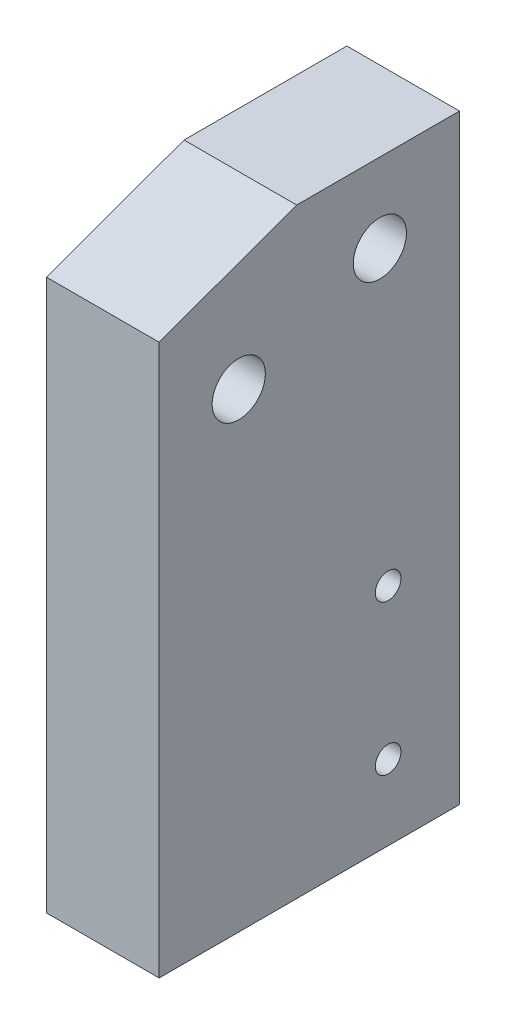
ISO-10303-21;
HEADER;
FILE_DESCRIPTION(('STEP AP214'),'2;1');
FILE_NAME('part.step','',(''),(''),'','','');
FILE_SCHEMA(('AUTOMOTIVE_DESIGN { 1 0 10303 214 1 1 1 1 }'));
ENDSEC;
DATA;
#1=APPLICATION_CONTEXT('core data for automotive mechanical design processes');
#2=APPLICATION_PROTOCOL_DEFINITION('international standard','automotive_design',2000,#1);
#3=PRODUCT_CONTEXT('',#1,'mechanical');
#4=PRODUCT('Part','Part','',(#3));
#5=PRODUCT_RELATED_PRODUCT_CATEGORY('part','',(#4));
#6=PRODUCT_DEFINITION_FORMATION('','',#4);
#7=PRODUCT_DEFINITION_CONTEXT('part definition',#1,'design');
#8=PRODUCT_DEFINITION('design','',#6,#7);
#9=PRODUCT_DEFINITION_SHAPE('','',#8);
#10=(LENGTH_UNIT() NAMED_UNIT(*) SI_UNIT(.MILLI.,.METRE.));
#11=(NAMED_UNIT(*) PLANE_ANGLE_UNIT() SI_UNIT($,.RADIAN.));
#12=(NAMED_UNIT(*) SI_UNIT($,.STERADIAN.) SOLID_ANGLE_UNIT());
#13=UNCERTAINTY_MEASURE_WITH_UNIT(LENGTH_MEASURE(1.E-05),#10,'distance_accuracy_value','');
#14=(GEOMETRIC_REPRESENTATION_CONTEXT(3) GLOBAL_UNCERTAINTY_ASSIGNED_CONTEXT((#13)) GLOBAL_UNIT_ASSIGNED_CONTEXT((#10,
#11,#12)) REPRESENTATION_CONTEXT('',''));
#15=CARTESIAN_POINT('',(0.,0.,0.));
#16=DIRECTION('',(0.,0.,1.));
#17=DIRECTION('',(1.,0.,0.));
#18=AXIS2_PLACEMENT_3D('',#15,#16,#17);
#19=CARTESIAN_POINT('',(28.575,152.4,0.));
#20=DIRECTION('',(-1.,0.,0.));
#21=DIRECTION('',(0.,0.,1.));
#22=AXIS2_PLACEMENT_3D('',#19,#20,#21);
#23=PLANE('',#22);
#24=CARTESIAN_POINT('',(28.575,57.15,-58.1000000000001));
#25=DIRECTION('',(1.,0.,0.));
#26=DIRECTION('',(0.,0.,-1.));
#27=AXIS2_PLACEMENT_3D('',#24,#25,#26);
#28=CIRCLE('',#27,3.26389999999999);
#29=CARTESIAN_POINT('',(28.575,57.15,-61.3639000000001));
#30=VERTEX_POINT('',#29);
#31=EDGE_CURVE('E220',#30,#30,#28,.T.);
#32=ORIENTED_EDGE('',*,*,#31,.F.);
#33=EDGE_LOOP('',(#32));
#34=FACE_BOUND('',#33,.T.);
#35=CARTESIAN_POINT('',(28.575,19.05,-58.1000000000001));
#36=DIRECTION('',(1.,0.,0.));
#37=DIRECTION('',(0.,0.,-1.));
#38=AXIS2_PLACEMENT_3D('',#35,#36,#37);
#39=CIRCLE('',#38,3.26389999999999);
#40=CARTESIAN_POINT('',(28.575,19.05,-61.3639000000001));
#41=VERTEX_POINT('',#40);
#42=EDGE_CURVE('E166',#41,#41,#39,.T.);
#43=ORIENTED_EDGE('',*,*,#42,.F.);
#44=EDGE_LOOP('',(#43));
#45=FACE_BOUND('',#44,.T.);
#46=CARTESIAN_POINT('',(28.575,132.348217804812,-56.0011444259716));
#47=DIRECTION('',(1.,0.,0.));
#48=DIRECTION('',(0.,0.,-1.));
#49=AXIS2_PLACEMENT_3D('',#46,#47,#48);
#50=CIRCLE('',#49,6.74623999999999);
#51=CARTESIAN_POINT('',(28.575,132.348217804812,-62.7473844259716));
#52=VERTEX_POINT('',#51);
#53=EDGE_CURVE('E165',#52,#52,#50,.T.);
#54=ORIENTED_EDGE('',*,*,#53,.F.);
#55=EDGE_LOOP('',(#54));
#56=FACE_BOUND('',#55,.T.);
#57=DIRECTION('',(0.,0.,-1.));
#58=VECTOR('',#57,1.);
#59=CARTESIAN_POINT('',(28.575,152.4,0.));
#60=LINE('',#59,#58);
#61=CARTESIAN_POINT('',(28.575,152.4,-34.8929632270751));
#62=VERTEX_POINT('',#61);
#63=CARTESIAN_POINT('',(28.575,152.4,-76.2));
#64=VERTEX_POINT('',#63);
#65=EDGE_CURVE('E186',#62,#64,#60,.T.);
#66=ORIENTED_EDGE('',*,*,#65,.F.);
#67=DIRECTION('',(0.,-0.342020143325656,0.939692620785913));
#68=VECTOR('',#67,1.);
#69=CARTESIAN_POINT('',(28.575,152.4,-34.8929632270751));
#70=LINE('',#69,#68);
#71=CARTESIAN_POINT('',(28.575,139.7,0.));
#72=VERTEX_POINT('',#71);
#73=EDGE_CURVE('E57',#62,#72,#70,.T.);
#74=ORIENTED_EDGE('',*,*,#73,.T.);
#75=DIRECTION('',(0.,-1.,0.));
#76=VECTOR('',#75,1.);
#77=CARTESIAN_POINT('',(28.575,152.4,0.));
#78=LINE('',#77,#76);
#79=CARTESIAN_POINT('',(28.575,0.,0.));
#80=VERTEX_POINT('',#79);
#81=EDGE_CURVE('E50',#72,#80,#78,.T.);
#82=ORIENTED_EDGE('',*,*,#81,.T.);
#83=DIRECTION('',(0.,0.,-1.));
#84=VECTOR('',#83,1.);
#85=CARTESIAN_POINT('',(28.575,0.,0.));
#86=LINE('',#85,#84);
#87=CARTESIAN_POINT('',(28.575,0.,-76.2));
#88=VERTEX_POINT('',#87);
#89=EDGE_CURVE('E96',#80,#88,#86,.T.);
#90=ORIENTED_EDGE('',*,*,#89,.T.);
#91=DIRECTION('',(0.,-1.,0.));
#92=VECTOR('',#91,1.);
#93=CARTESIAN_POINT('',(28.575,152.4,-76.2));
#94=LINE('',#93,#92);
#95=EDGE_CURVE('E90',#64,#88,#94,.T.);
#96=ORIENTED_EDGE('',*,*,#95,.F.);
#97=EDGE_LOOP('',(#66,#74,#82,#90,#96));
#98=FACE_BOUND('',#97,.T.);
#99=CARTESIAN_POINT('',(28.575,119.317250344104,-20.1988555740284));
#100=DIRECTION('',(1.,0.,0.));
#101=DIRECTION('',(0.,0.,-1.));
#102=AXIS2_PLACEMENT_3D('',#99,#100,#101);
#103=CIRCLE('',#102,6.74623999999999);
#104=CARTESIAN_POINT('',(28.575,119.317250344104,-26.9450955740284));
#105=VERTEX_POINT('',#104);
#106=EDGE_CURVE('E117',#105,#105,#103,.T.);
#107=ORIENTED_EDGE('',*,*,#106,.F.);
#108=EDGE_LOOP('',(#107));
#109=FACE_BOUND('',#108,.T.);
#110=ADVANCED_FACE('F41',(#34,#45,#56,#98,#109),#23,.F.);
#111=CARTESIAN_POINT('',(0.,152.4,0.));
#112=DIRECTION('',(1.,0.,0.));
#113=DIRECTION('',(0.,0.,-1.));
#114=AXIS2_PLACEMENT_3D('',#111,#112,#113);
#115=PLANE('',#114);
#116=CARTESIAN_POINT('',(0.,57.15,-18.1));
#117=DIRECTION('',(-1.,0.,0.));
#118=DIRECTION('',(0.,0.,1.));
#119=AXIS2_PLACEMENT_3D('',#116,#117,#118);
#120=CIRCLE('',#119,3.26389999999999);
#121=CARTESIAN_POINT('',(0.,57.15,-14.8361));
#122=VERTEX_POINT('',#121);
#123=EDGE_CURVE('E201',#122,#122,#120,.T.);
#124=ORIENTED_EDGE('',*,*,#123,.F.);
#125=EDGE_LOOP('',(#124));
#126=FACE_BOUND('',#125,.T.);
#127=CARTESIAN_POINT('',(0.,19.05,-18.1));
#128=DIRECTION('',(-1.,0.,0.));
#129=DIRECTION('',(0.,0.,1.));
#130=AXIS2_PLACEMENT_3D('',#127,#128,#129);
#131=CIRCLE('',#130,3.26389999999999);
#132=CARTESIAN_POINT('',(0.,19.05,-14.8361));
#133=VERTEX_POINT('',#132);
#134=EDGE_CURVE('E212',#133,#133,#131,.T.);
#135=ORIENTED_EDGE('',*,*,#134,.F.);
#136=EDGE_LOOP('',(#135));
#137=FACE_BOUND('',#136,.T.);
#138=CARTESIAN_POINT('',(0.,132.348217804812,-56.0011444259716));
#139=DIRECTION('',(1.,0.,0.));
#140=DIRECTION('',(0.,0.,-1.));
#141=AXIS2_PLACEMENT_3D('',#138,#139,#140);
#142=CIRCLE('',#141,6.74623999999999);
#143=CARTESIAN_POINT('',(0.,132.348217804812,-62.7473844259716));
#144=VERTEX_POINT('',#143);
#145=EDGE_CURVE('E172',#144,#144,#142,.T.);
#146=ORIENTED_EDGE('',*,*,#145,.T.);
#147=EDGE_LOOP('',(#146));
#148=FACE_BOUND('',#147,.T.);
#149=CARTESIAN_POINT('',(0.,119.317250344104,-20.1988555740284));
#150=DIRECTION('',(1.,0.,0.));
#151=DIRECTION('',(0.,0.,-1.));
#152=AXIS2_PLACEMENT_3D('',#149,#150,#151);
#153=CIRCLE('',#152,6.74623999999999);
#154=CARTESIAN_POINT('',(0.,119.317250344104,-26.9450955740284));
#155=VERTEX_POINT('',#154);
#156=EDGE_CURVE('E110',#155,#155,#153,.T.);
#157=ORIENTED_EDGE('',*,*,#156,.T.);
#158=EDGE_LOOP('',(#157));
#159=FACE_BOUND('',#158,.T.);
#160=DIRECTION('',(0.,-1.,0.));
#161=VECTOR('',#160,1.);
#162=CARTESIAN_POINT('',(0.,152.4,0.));
#163=LINE('',#162,#161);
#164=CARTESIAN_POINT('',(0.,139.7,0.));
#165=VERTEX_POINT('',#164);
#166=CARTESIAN_POINT('',(0.,0.,0.));
#167=VERTEX_POINT('',#166);
#168=EDGE_CURVE('E11',#165,#167,#163,.T.);
#169=ORIENTED_EDGE('',*,*,#168,.F.);
#170=DIRECTION('',(0.,-0.342020143325656,0.939692620785913));
#171=VECTOR('',#170,1.);
#172=CARTESIAN_POINT('',(0.,152.4,-34.8929632270751));
#173=LINE('',#172,#171);
#174=CARTESIAN_POINT('',(0.,152.4,-34.8929632270751));
#175=VERTEX_POINT('',#174);
#176=EDGE_CURVE('E139',#175,#165,#173,.T.);
#177=ORIENTED_EDGE('',*,*,#176,.F.);
#178=DIRECTION('',(0.,0.,1.));
#179=VECTOR('',#178,1.);
#180=CARTESIAN_POINT('',(0.,152.4,0.));
#181=LINE('',#180,#179);
#182=CARTESIAN_POINT('',(0.,152.4,-76.2));
#183=VERTEX_POINT('',#182);
#184=EDGE_CURVE('E95',#183,#175,#181,.T.);
#185=ORIENTED_EDGE('',*,*,#184,.F.);
#186=DIRECTION('',(0.,-1.,0.));
#187=VECTOR('',#186,1.);
#188=CARTESIAN_POINT('',(0.,152.4,-76.2));
#189=LINE('',#188,#187);
#190=CARTESIAN_POINT('',(0.,0.,-76.2));
#191=VERTEX_POINT('',#190);
#192=EDGE_CURVE('E87',#183,#191,#189,.T.);
#193=ORIENTED_EDGE('',*,*,#192,.T.);
#194=DIRECTION('',(0.,0.,1.));
#195=VECTOR('',#194,1.);
#196=CARTESIAN_POINT('',(0.,0.,0.));
#197=LINE('',#196,#195);
#198=EDGE_CURVE('E101',#191,#167,#197,.T.);
#199=ORIENTED_EDGE('',*,*,#198,.T.);
#200=EDGE_LOOP('',(#169,#177,#185,#193,#199));
#201=FACE_BOUND('',#200,.T.);
#202=ADVANCED_FACE('F43',(#126,#137,#148,#159,#201),#115,.F.);
#203=CARTESIAN_POINT('',(0.,152.4,0.));
#204=DIRECTION('',(0.,0.,-1.));
#205=DIRECTION('',(-1.,0.,0.));
#206=AXIS2_PLACEMENT_3D('',#203,#204,#205);
#207=PLANE('',#206);
#208=ORIENTED_EDGE('',*,*,#81,.F.);
#209=DIRECTION('',(-1.,0.,0.));
#210=VECTOR('',#209,1.);
#211=CARTESIAN_POINT('',(28.575,139.7,0.));
#212=LINE('',#211,#210);
#213=EDGE_CURVE('E136',#72,#165,#212,.T.);
#214=ORIENTED_EDGE('',*,*,#213,.T.);
#215=ORIENTED_EDGE('',*,*,#168,.T.);
#216=DIRECTION('',(1.,0.,0.));
#217=VECTOR('',#216,1.);
#218=CARTESIAN_POINT('',(0.,0.,0.));
#219=LINE('',#218,#217);
#220=EDGE_CURVE('E108',#167,#80,#219,.T.);
#221=ORIENTED_EDGE('',*,*,#220,.T.);
#222=EDGE_LOOP('',(#208,#214,#215,#221));
#223=FACE_BOUND('',#222,.T.);
#224=ADVANCED_FACE('F134',(#223),#207,.F.);
#225=CARTESIAN_POINT('',(0.,152.4,-76.2));
#226=DIRECTION('',(0.,0.,1.));
#227=DIRECTION('',(1.,0.,0.));
#228=AXIS2_PLACEMENT_3D('',#225,#226,#227);
#229=PLANE('',#228);
#230=DIRECTION('',(-1.,0.,0.));
#231=VECTOR('',#230,1.);
#232=CARTESIAN_POINT('',(0.,0.,-76.2));
#233=LINE('',#232,#231);
#234=EDGE_CURVE('E84',#88,#191,#233,.T.);
#235=ORIENTED_EDGE('',*,*,#234,.T.);
#236=ORIENTED_EDGE('',*,*,#192,.F.);
#237=DIRECTION('',(-1.,0.,0.));
#238=VECTOR('',#237,1.);
#239=CARTESIAN_POINT('',(0.,152.4,-76.2));
#240=LINE('',#239,#238);
#241=EDGE_CURVE('E66',#64,#183,#240,.T.);
#242=ORIENTED_EDGE('',*,*,#241,.F.);
#243=ORIENTED_EDGE('',*,*,#95,.T.);
#244=EDGE_LOOP('',(#235,#236,#242,#243));
#245=FACE_BOUND('',#244,.T.);
#246=ADVANCED_FACE('F86',(#245),#229,.F.);
#247=CARTESIAN_POINT('',(0.,152.4,0.));
#248=DIRECTION('',(0.,-1.,0.));
#249=DIRECTION('',(0.,0.,-1.));
#250=AXIS2_PLACEMENT_3D('',#247,#248,#249);
#251=PLANE('',#250);
#252=ORIENTED_EDGE('',*,*,#184,.T.);
#253=DIRECTION('',(-1.,0.,0.));
#254=VECTOR('',#253,1.);
#255=CARTESIAN_POINT('',(28.575,152.4,-34.8929632270751));
#256=LINE('',#255,#254);
#257=EDGE_CURVE('E195',#62,#175,#256,.T.);
#258=ORIENTED_EDGE('',*,*,#257,.F.);
#259=ORIENTED_EDGE('',*,*,#65,.T.);
#260=ORIENTED_EDGE('',*,*,#241,.T.);
#261=EDGE_LOOP('',(#252,#258,#259,#260));
#262=FACE_BOUND('',#261,.T.);
#263=ADVANCED_FACE('F194',(#262),#251,.F.);
#264=CARTESIAN_POINT('',(0.,0.,0.));
#265=DIRECTION('',(0.,-1.,0.));
#266=DIRECTION('',(0.,0.,-1.));
#267=AXIS2_PLACEMENT_3D('',#264,#265,#266);
#268=PLANE('',#267);
#269=ORIENTED_EDGE('',*,*,#198,.F.);
#270=ORIENTED_EDGE('',*,*,#234,.F.);
#271=ORIENTED_EDGE('',*,*,#89,.F.);
#272=ORIENTED_EDGE('',*,*,#220,.F.);
#273=EDGE_LOOP('',(#269,#270,#271,#272));
#274=FACE_BOUND('',#273,.T.);
#275=ADVANCED_FACE('F106',(#274),#268,.T.);
#276=CARTESIAN_POINT('',(28.575,119.317250344104,-20.1988555740284));
#277=DIRECTION('',(1.,0.,0.));
#278=DIRECTION('',(0.,0.,-1.));
#279=AXIS2_PLACEMENT_3D('',#276,#277,#278);
#280=CYLINDRICAL_SURFACE('',#279,6.74623999999999);
#281=ORIENTED_EDGE('',*,*,#156,.F.);
#282=EDGE_LOOP('',(#281));
#283=FACE_BOUND('',#282,.T.);
#284=ORIENTED_EDGE('',*,*,#106,.T.);
#285=EDGE_LOOP('',(#284));
#286=FACE_BOUND('',#285,.T.);
#287=ADVANCED_FACE('F245',(#283,#286),#280,.F.);
#288=CARTESIAN_POINT('',(28.575,132.348217804812,-56.0011444259716));
#289=DIRECTION('',(1.,0.,0.));
#290=DIRECTION('',(0.,0.,-1.));
#291=AXIS2_PLACEMENT_3D('',#288,#289,#290);
#292=CYLINDRICAL_SURFACE('',#291,6.74623999999999);
#293=ORIENTED_EDGE('',*,*,#145,.F.);
#294=EDGE_LOOP('',(#293));
#295=FACE_BOUND('',#294,.T.);
#296=ORIENTED_EDGE('',*,*,#53,.T.);
#297=EDGE_LOOP('',(#296));
#298=FACE_BOUND('',#297,.T.);
#299=ADVANCED_FACE('F158',(#295,#298),#292,.F.);
#300=CARTESIAN_POINT('',(15.875,19.05,-58.1000000000001));
#301=DIRECTION('',(1.,0.,0.));
#302=DIRECTION('',(0.,0.,-1.));
#303=AXIS2_PLACEMENT_3D('',#300,#301,#302);
#304=CONICAL_SURFACE('',#303,3.2639,1.02974425867665);
#305=CARTESIAN_POINT('',(13.9138510255559,19.05,-58.1000000000001));
#306=VERTEX_POINT('',#305);
#307=VERTEX_LOOP('',#306);
#308=FACE_BOUND('',#307,.T.);
#309=CARTESIAN_POINT('',(15.875,19.05,-58.1000000000001));
#310=DIRECTION('',(1.,0.,0.));
#311=DIRECTION('',(0.,0.,-1.));
#312=AXIS2_PLACEMENT_3D('',#309,#310,#311);
#313=CIRCLE('',#312,3.2639);
#314=CARTESIAN_POINT('',(15.875,19.05,-61.3639000000001));
#315=VERTEX_POINT('',#314);
#316=EDGE_CURVE('E162',#315,#315,#313,.T.);
#317=ORIENTED_EDGE('',*,*,#316,.T.);
#318=EDGE_LOOP('',(#317));
#319=FACE_BOUND('',#318,.T.);
#320=ADVANCED_FACE('F154',(#308,#319),#304,.F.);
#321=CARTESIAN_POINT('',(28.575,19.05,-58.1000000000001));
#322=DIRECTION('',(1.,0.,0.));
#323=DIRECTION('',(0.,0.,-1.));
#324=AXIS2_PLACEMENT_3D('',#321,#322,#323);
#325=CYLINDRICAL_SURFACE('',#324,3.26389999999999);
#326=ORIENTED_EDGE('',*,*,#316,.F.);
#327=EDGE_LOOP('',(#326));
#328=FACE_BOUND('',#327,.T.);
#329=ORIENTED_EDGE('',*,*,#42,.T.);
#330=EDGE_LOOP('',(#329));
#331=FACE_BOUND('',#330,.T.);
#332=ADVANCED_FACE('F157',(#328,#331),#325,.F.);
#333=CARTESIAN_POINT('',(15.875,57.15,-58.1000000000001));
#334=DIRECTION('',(1.,0.,0.));
#335=DIRECTION('',(0.,0.,-1.));
#336=AXIS2_PLACEMENT_3D('',#333,#334,#335);
#337=CONICAL_SURFACE('',#336,3.26389999999999,1.02974425867665);
#338=CARTESIAN_POINT('',(13.9138510255559,57.15,-58.1000000000001));
#339=VERTEX_POINT('',#338);
#340=VERTEX_LOOP('',#339);
#341=FACE_BOUND('',#340,.T.);
#342=CARTESIAN_POINT('',(15.875,57.15,-58.1000000000001));
#343=DIRECTION('',(1.,0.,0.));
#344=DIRECTION('',(0.,0.,-1.));
#345=AXIS2_PLACEMENT_3D('',#342,#343,#344);
#346=CIRCLE('',#345,3.26389999999999);
#347=CARTESIAN_POINT('',(15.875,57.15,-61.3639000000001));
#348=VERTEX_POINT('',#347);
#349=EDGE_CURVE('E175',#348,#348,#346,.T.);
#350=ORIENTED_EDGE('',*,*,#349,.T.);
#351=EDGE_LOOP('',(#350));
#352=FACE_BOUND('',#351,.T.);
#353=ADVANCED_FACE('F228',(#341,#352),#337,.F.);
#354=CARTESIAN_POINT('',(28.575,57.15,-58.1000000000001));
#355=DIRECTION('',(1.,0.,0.));
#356=DIRECTION('',(0.,0.,-1.));
#357=AXIS2_PLACEMENT_3D('',#354,#355,#356);
#358=CYLINDRICAL_SURFACE('',#357,3.26389999999999);
#359=ORIENTED_EDGE('',*,*,#349,.F.);
#360=EDGE_LOOP('',(#359));
#361=FACE_BOUND('',#360,.T.);
#362=ORIENTED_EDGE('',*,*,#31,.T.);
#363=EDGE_LOOP('',(#362));
#364=FACE_BOUND('',#363,.T.);
#365=ADVANCED_FACE('F230',(#361,#364),#358,.F.);
#366=CARTESIAN_POINT('',(12.7,19.05,-18.1));
#367=DIRECTION('',(-1.,0.,0.));
#368=DIRECTION('',(0.,0.,1.));
#369=AXIS2_PLACEMENT_3D('',#366,#367,#368);
#370=CONICAL_SURFACE('',#369,3.26389999999999,1.02974425867665);
#371=CARTESIAN_POINT('',(14.6611489744441,19.05,-18.1));
#372=VERTEX_POINT('',#371);
#373=VERTEX_LOOP('',#372);
#374=FACE_BOUND('',#373,.T.);
#375=CARTESIAN_POINT('',(12.7,19.05,-18.1));
#376=DIRECTION('',(-1.,0.,0.));
#377=DIRECTION('',(0.,0.,1.));
#378=AXIS2_PLACEMENT_3D('',#375,#376,#377);
#379=CIRCLE('',#378,3.26389999999999);
#380=CARTESIAN_POINT('',(12.7,19.05,-14.8361));
#381=VERTEX_POINT('',#380);
#382=EDGE_CURVE('E216',#381,#381,#379,.T.);
#383=ORIENTED_EDGE('',*,*,#382,.T.);
#384=EDGE_LOOP('',(#383));
#385=FACE_BOUND('',#384,.T.);
#386=ADVANCED_FACE('F233',(#374,#385),#370,.F.);
#387=CARTESIAN_POINT('',(0.,19.05,-18.1));
#388=DIRECTION('',(-1.,0.,0.));
#389=DIRECTION('',(0.,0.,1.));
#390=AXIS2_PLACEMENT_3D('',#387,#388,#389);
#391=CYLINDRICAL_SURFACE('',#390,3.26389999999999);
#392=ORIENTED_EDGE('',*,*,#382,.F.);
#393=EDGE_LOOP('',(#392));
#394=FACE_BOUND('',#393,.T.);
#395=ORIENTED_EDGE('',*,*,#134,.T.);
#396=EDGE_LOOP('',(#395));
#397=FACE_BOUND('',#396,.T.);
#398=ADVANCED_FACE('F277',(#394,#397),#391,.F.);
#399=CARTESIAN_POINT('',(12.7,57.15,-18.1));
#400=DIRECTION('',(-1.,0.,0.));
#401=DIRECTION('',(0.,0.,1.));
#402=AXIS2_PLACEMENT_3D('',#399,#400,#401);
#403=CONICAL_SURFACE('',#402,3.26389999999999,1.02974425867665);
#404=CARTESIAN_POINT('',(14.6611489744441,57.15,-18.1));
#405=VERTEX_POINT('',#404);
#406=VERTEX_LOOP('',#405);
#407=FACE_BOUND('',#406,.T.);
#408=CARTESIAN_POINT('',(12.7,57.15,-18.1));
#409=DIRECTION('',(-1.,0.,0.));
#410=DIRECTION('',(0.,0.,1.));
#411=AXIS2_PLACEMENT_3D('',#408,#409,#410);
#412=CIRCLE('',#411,3.26389999999999);
#413=CARTESIAN_POINT('',(12.7,57.15,-14.8361));
#414=VERTEX_POINT('',#413);
#415=EDGE_CURVE('E208',#414,#414,#412,.T.);
#416=ORIENTED_EDGE('',*,*,#415,.T.);
#417=EDGE_LOOP('',(#416));
#418=FACE_BOUND('',#417,.T.);
#419=ADVANCED_FACE('F279',(#407,#418),#403,.F.);
#420=CARTESIAN_POINT('',(0.,57.15,-18.1));
#421=DIRECTION('',(-1.,0.,0.));
#422=DIRECTION('',(0.,0.,1.));
#423=AXIS2_PLACEMENT_3D('',#420,#421,#422);
#424=CYLINDRICAL_SURFACE('',#423,3.26389999999999);
#425=ORIENTED_EDGE('',*,*,#415,.F.);
#426=EDGE_LOOP('',(#425));
#427=FACE_BOUND('',#426,.T.);
#428=ORIENTED_EDGE('',*,*,#123,.T.);
#429=EDGE_LOOP('',(#428));
#430=FACE_BOUND('',#429,.T.);
#431=ADVANCED_FACE('F286',(#427,#430),#424,.F.);
#432=CARTESIAN_POINT('',(28.575,152.4,-34.8929632270751));
#433=DIRECTION('',(0.,-0.939692620785913,-0.342020143325656));
#434=DIRECTION('',(0.,0.342020143325656,-0.939692620785913));
#435=AXIS2_PLACEMENT_3D('',#432,#433,#434);
#436=PLANE('',#435);
#437=ORIENTED_EDGE('',*,*,#176,.T.);
#438=ORIENTED_EDGE('',*,*,#213,.F.);
#439=ORIENTED_EDGE('',*,*,#73,.F.);
#440=ORIENTED_EDGE('',*,*,#257,.T.);
#441=EDGE_LOOP('',(#437,#438,#439,#440));
#442=FACE_BOUND('',#441,.T.);
#443=ADVANCED_FACE('F336',(#442),#436,.F.);
#444=CLOSED_SHELL('',(#110,#202,#224,#246,#263,#275,#287,#299,#320,#332,#353,#365,#386,#398,
#419,#431,#443));
#445=MANIFOLD_SOLID_BREP('B2',#444);
#446=ADVANCED_BREP_SHAPE_REPRESENTATION('',(#18,#445),#14);
#447=SHAPE_DEFINITION_REPRESENTATION(#9,#446);
ENDSEC;
END-ISO-10303-21;
